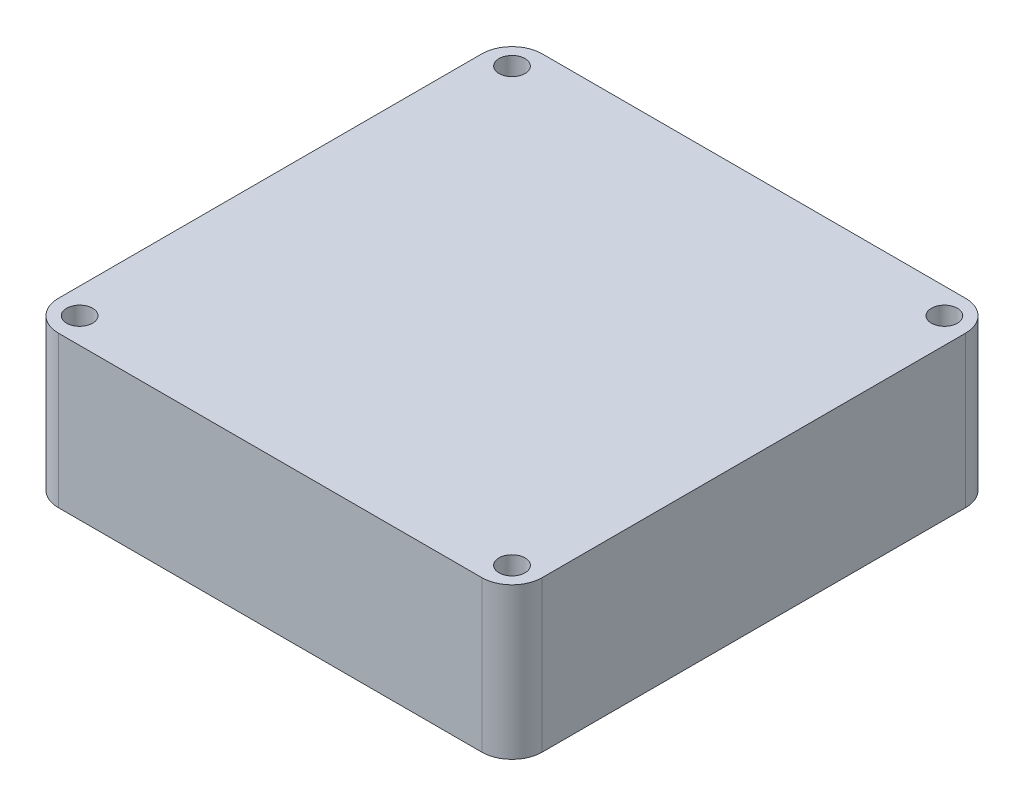
ISO-10303-21;
HEADER;
FILE_DESCRIPTION(('STEP AP214'),'2;1');
FILE_NAME('part.step','',(''),(''),'','','');
FILE_SCHEMA(('AUTOMOTIVE_DESIGN { 1 0 10303 214 1 1 1 1 }'));
ENDSEC;
DATA;
#1=APPLICATION_CONTEXT('core data for automotive mechanical design processes');
#2=APPLICATION_PROTOCOL_DEFINITION('international standard','automotive_design',2000,#1);
#3=PRODUCT_CONTEXT('',#1,'mechanical');
#4=PRODUCT('Part','Part','',(#3));
#5=PRODUCT_RELATED_PRODUCT_CATEGORY('part','',(#4));
#6=PRODUCT_DEFINITION_FORMATION('','',#4);
#7=PRODUCT_DEFINITION_CONTEXT('part definition',#1,'design');
#8=PRODUCT_DEFINITION('design','',#6,#7);
#9=PRODUCT_DEFINITION_SHAPE('','',#8);
#10=(LENGTH_UNIT() NAMED_UNIT(*) SI_UNIT(.MILLI.,.METRE.));
#11=(NAMED_UNIT(*) PLANE_ANGLE_UNIT() SI_UNIT($,.RADIAN.));
#12=(NAMED_UNIT(*) SI_UNIT($,.STERADIAN.) SOLID_ANGLE_UNIT());
#13=UNCERTAINTY_MEASURE_WITH_UNIT(LENGTH_MEASURE(1.E-05),#10,'distance_accuracy_value','');
#14=(GEOMETRIC_REPRESENTATION_CONTEXT(3) GLOBAL_UNCERTAINTY_ASSIGNED_CONTEXT((#13)) GLOBAL_UNIT_ASSIGNED_CONTEXT((#10,
#11,#12)) REPRESENTATION_CONTEXT('',''));
#15=CARTESIAN_POINT('',(0.,0.,0.));
#16=DIRECTION('',(0.,0.,1.));
#17=DIRECTION('',(1.,0.,0.));
#18=AXIS2_PLACEMENT_3D('',#15,#16,#17);
#19=CARTESIAN_POINT('',(0.,25.,0.));
#20=DIRECTION('',(0.,1.,0.));
#21=DIRECTION('',(0.,0.,1.));
#22=AXIS2_PLACEMENT_3D('',#19,#20,#21);
#23=PLANE('',#22);
#24=CARTESIAN_POINT('',(-35.7499999999999,25.,35.75));
#25=DIRECTION('',(0.,1.,0.));
#26=DIRECTION('',(0.,0.,1.));
#27=AXIS2_PLACEMENT_3D('',#24,#25,#26);
#28=CIRCLE('',#27,2.15000000000028);
#29=CARTESIAN_POINT('',(-35.7499999999999,25.,37.9000000000003));
#30=VERTEX_POINT('',#29);
#31=EDGE_CURVE('E189',#30,#30,#28,.T.);
#32=ORIENTED_EDGE('',*,*,#31,.F.);
#33=EDGE_LOOP('',(#32));
#34=FACE_BOUND('',#33,.T.);
#35=CARTESIAN_POINT('',(35.75,25.,-35.75));
#36=DIRECTION('',(0.,1.,0.));
#37=DIRECTION('',(0.,0.,1.));
#38=AXIS2_PLACEMENT_3D('',#35,#36,#37);
#39=CIRCLE('',#38,2.15);
#40=CARTESIAN_POINT('',(35.75,25.,-33.6));
#41=VERTEX_POINT('',#40);
#42=EDGE_CURVE('E179',#41,#41,#39,.T.);
#43=ORIENTED_EDGE('',*,*,#42,.F.);
#44=EDGE_LOOP('',(#43));
#45=FACE_BOUND('',#44,.T.);
#46=DIRECTION('',(-1.,0.,0.));
#47=VECTOR('',#46,1.);
#48=CARTESIAN_POINT('',(-40.,25.,-40.));
#49=LINE('',#48,#47);
#50=CARTESIAN_POINT('',(35.,25.,-40.));
#51=VERTEX_POINT('',#50);
#52=CARTESIAN_POINT('',(-35.,25.,-40.));
#53=VERTEX_POINT('',#52);
#54=EDGE_CURVE('E170',#51,#53,#49,.T.);
#55=ORIENTED_EDGE('',*,*,#54,.T.);
#56=CARTESIAN_POINT('',(-35.,25.,-35.));
#57=DIRECTION('',(0.,1.,0.));
#58=DIRECTION('',(0.,0.,1.));
#59=AXIS2_PLACEMENT_3D('',#56,#57,#58);
#60=CIRCLE('',#59,5.);
#61=CARTESIAN_POINT('',(-40.,25.,-35.));
#62=VERTEX_POINT('',#61);
#63=EDGE_CURVE('E148',#53,#62,#60,.T.);
#64=ORIENTED_EDGE('',*,*,#63,.T.);
#65=DIRECTION('',(0.,0.,1.));
#66=VECTOR('',#65,1.);
#67=CARTESIAN_POINT('',(-40.,25.,-40.));
#68=LINE('',#67,#66);
#69=CARTESIAN_POINT('',(-40.,25.,35.));
#70=VERTEX_POINT('',#69);
#71=EDGE_CURVE('E118',#62,#70,#68,.T.);
#72=ORIENTED_EDGE('',*,*,#71,.T.);
#73=CARTESIAN_POINT('',(-35.,25.,35.));
#74=DIRECTION('',(0.,1.,0.));
#75=DIRECTION('',(0.,0.,1.));
#76=AXIS2_PLACEMENT_3D('',#73,#74,#75);
#77=CIRCLE('',#76,5.);
#78=CARTESIAN_POINT('',(-35.,25.,40.));
#79=VERTEX_POINT('',#78);
#80=EDGE_CURVE('E54',#70,#79,#77,.T.);
#81=ORIENTED_EDGE('',*,*,#80,.T.);
#82=DIRECTION('',(1.,0.,0.));
#83=VECTOR('',#82,1.);
#84=CARTESIAN_POINT('',(-40.,25.,40.));
#85=LINE('',#84,#83);
#86=CARTESIAN_POINT('',(35.,25.,40.));
#87=VERTEX_POINT('',#86);
#88=EDGE_CURVE('E134',#79,#87,#85,.T.);
#89=ORIENTED_EDGE('',*,*,#88,.T.);
#90=CARTESIAN_POINT('',(35.,25.,35.));
#91=DIRECTION('',(0.,1.,0.));
#92=DIRECTION('',(0.,0.,1.));
#93=AXIS2_PLACEMENT_3D('',#90,#91,#92);
#94=CIRCLE('',#93,5.);
#95=CARTESIAN_POINT('',(40.,25.,35.));
#96=VERTEX_POINT('',#95);
#97=EDGE_CURVE('E144',#87,#96,#94,.T.);
#98=ORIENTED_EDGE('',*,*,#97,.T.);
#99=DIRECTION('',(0.,0.,-1.));
#100=VECTOR('',#99,1.);
#101=CARTESIAN_POINT('',(40.,25.,-40.));
#102=LINE('',#101,#100);
#103=CARTESIAN_POINT('',(40.,25.,-35.));
#104=VERTEX_POINT('',#103);
#105=EDGE_CURVE('E128',#96,#104,#102,.T.);
#106=ORIENTED_EDGE('',*,*,#105,.T.);
#107=CARTESIAN_POINT('',(35.,25.,-35.));
#108=DIRECTION('',(0.,1.,0.));
#109=DIRECTION('',(0.,0.,1.));
#110=AXIS2_PLACEMENT_3D('',#107,#108,#109);
#111=CIRCLE('',#110,5.);
#112=EDGE_CURVE('E146',#104,#51,#111,.T.);
#113=ORIENTED_EDGE('',*,*,#112,.T.);
#114=EDGE_LOOP('',(#55,#64,#72,#81,#89,#98,#106,#113));
#115=FACE_BOUND('',#114,.T.);
#116=CARTESIAN_POINT('',(35.7500000000001,25.,35.75));
#117=DIRECTION('',(0.,1.,0.));
#118=DIRECTION('',(0.,0.,1.));
#119=AXIS2_PLACEMENT_3D('',#116,#117,#118);
#120=CIRCLE('',#119,2.15000000000003);
#121=CARTESIAN_POINT('',(35.7500000000001,25.,37.9));
#122=VERTEX_POINT('',#121);
#123=EDGE_CURVE('E184',#122,#122,#120,.T.);
#124=ORIENTED_EDGE('',*,*,#123,.F.);
#125=EDGE_LOOP('',(#124));
#126=FACE_BOUND('',#125,.T.);
#127=CARTESIAN_POINT('',(-35.7499999999999,25.,-35.75));
#128=DIRECTION('',(0.,1.,0.));
#129=DIRECTION('',(0.,0.,1.));
#130=AXIS2_PLACEMENT_3D('',#127,#128,#129);
#131=CIRCLE('',#130,2.1500000000003);
#132=CARTESIAN_POINT('',(-35.7499999999999,25.,-33.5999999999997));
#133=VERTEX_POINT('',#132);
#134=EDGE_CURVE('E195',#133,#133,#131,.T.);
#135=ORIENTED_EDGE('',*,*,#134,.F.);
#136=EDGE_LOOP('',(#135));
#137=FACE_BOUND('',#136,.T.);
#138=ADVANCED_FACE('F34',(#34,#45,#115,#126,#137),#23,.T.);
#139=CARTESIAN_POINT('',(0.,0.,0.));
#140=DIRECTION('',(0.,1.,0.));
#141=DIRECTION('',(0.,0.,1.));
#142=AXIS2_PLACEMENT_3D('',#139,#140,#141);
#143=PLANE('',#142);
#144=DIRECTION('',(0.,0.,1.));
#145=VECTOR('',#144,1.);
#146=CARTESIAN_POINT('',(-40.,0.,-40.));
#147=LINE('',#146,#145);
#148=CARTESIAN_POINT('',(-40.,0.,-35.));
#149=VERTEX_POINT('',#148);
#150=CARTESIAN_POINT('',(-40.,0.,35.));
#151=VERTEX_POINT('',#150);
#152=EDGE_CURVE('E116',#149,#151,#147,.T.);
#153=ORIENTED_EDGE('',*,*,#152,.F.);
#154=CARTESIAN_POINT('',(-35.,0.,-35.));
#155=DIRECTION('',(0.,1.,0.));
#156=DIRECTION('',(0.,0.,1.));
#157=AXIS2_PLACEMENT_3D('',#154,#155,#156);
#158=CIRCLE('',#157,5.);
#159=CARTESIAN_POINT('',(-35.,0.,-40.));
#160=VERTEX_POINT('',#159);
#161=EDGE_CURVE('E99',#149,#160,#158,.F.);
#162=ORIENTED_EDGE('',*,*,#161,.T.);
#163=DIRECTION('',(-1.,0.,0.));
#164=VECTOR('',#163,1.);
#165=CARTESIAN_POINT('',(-40.,0.,-40.));
#166=LINE('',#165,#164);
#167=CARTESIAN_POINT('',(35.,0.,-40.));
#168=VERTEX_POINT('',#167);
#169=EDGE_CURVE('E126',#168,#160,#166,.T.);
#170=ORIENTED_EDGE('',*,*,#169,.F.);
#171=CARTESIAN_POINT('',(35.,0.,-35.));
#172=DIRECTION('',(0.,1.,0.));
#173=DIRECTION('',(0.,0.,1.));
#174=AXIS2_PLACEMENT_3D('',#171,#172,#173);
#175=CIRCLE('',#174,5.);
#176=CARTESIAN_POINT('',(40.,0.,-35.));
#177=VERTEX_POINT('',#176);
#178=EDGE_CURVE('E110',#168,#177,#175,.F.);
#179=ORIENTED_EDGE('',*,*,#178,.T.);
#180=DIRECTION('',(0.,0.,-1.));
#181=VECTOR('',#180,1.);
#182=CARTESIAN_POINT('',(40.,0.,-40.));
#183=LINE('',#182,#181);
#184=CARTESIAN_POINT('',(40.,0.,35.));
#185=VERTEX_POINT('',#184);
#186=EDGE_CURVE('E130',#185,#177,#183,.T.);
#187=ORIENTED_EDGE('',*,*,#186,.F.);
#188=CARTESIAN_POINT('',(35.,0.,35.));
#189=DIRECTION('',(0.,1.,0.));
#190=DIRECTION('',(0.,0.,1.));
#191=AXIS2_PLACEMENT_3D('',#188,#189,#190);
#192=CIRCLE('',#191,5.);
#193=CARTESIAN_POINT('',(35.,0.,40.));
#194=VERTEX_POINT('',#193);
#195=EDGE_CURVE('E137',#185,#194,#192,.F.);
#196=ORIENTED_EDGE('',*,*,#195,.T.);
#197=DIRECTION('',(1.,0.,0.));
#198=VECTOR('',#197,1.);
#199=CARTESIAN_POINT('',(-40.,0.,40.));
#200=LINE('',#199,#198);
#201=CARTESIAN_POINT('',(-35.,0.,40.));
#202=VERTEX_POINT('',#201);
#203=EDGE_CURVE('E125',#202,#194,#200,.T.);
#204=ORIENTED_EDGE('',*,*,#203,.F.);
#205=CARTESIAN_POINT('',(-35.,0.,35.));
#206=DIRECTION('',(0.,1.,0.));
#207=DIRECTION('',(0.,0.,1.));
#208=AXIS2_PLACEMENT_3D('',#205,#206,#207);
#209=CIRCLE('',#208,5.);
#210=EDGE_CURVE('E119',#202,#151,#209,.F.);
#211=ORIENTED_EDGE('',*,*,#210,.T.);
#212=EDGE_LOOP('',(#153,#162,#170,#179,#187,#196,#204,#211));
#213=FACE_BOUND('',#212,.T.);
#214=CARTESIAN_POINT('',(35.75,0.,-35.75));
#215=DIRECTION('',(0.,1.,0.));
#216=DIRECTION('',(0.,0.,1.));
#217=AXIS2_PLACEMENT_3D('',#214,#215,#216);
#218=CIRCLE('',#217,2.15);
#219=CARTESIAN_POINT('',(35.75,0.,-33.6));
#220=VERTEX_POINT('',#219);
#221=EDGE_CURVE('E175',#220,#220,#218,.T.);
#222=ORIENTED_EDGE('',*,*,#221,.T.);
#223=EDGE_LOOP('',(#222));
#224=FACE_BOUND('',#223,.T.);
#225=CARTESIAN_POINT('',(35.7500000000001,0.,35.75));
#226=DIRECTION('',(0.,1.,0.));
#227=DIRECTION('',(0.,0.,1.));
#228=AXIS2_PLACEMENT_3D('',#225,#226,#227);
#229=CIRCLE('',#228,2.15000000000003);
#230=CARTESIAN_POINT('',(35.7500000000001,0.,37.9));
#231=VERTEX_POINT('',#230);
#232=EDGE_CURVE('E186',#231,#231,#229,.T.);
#233=ORIENTED_EDGE('',*,*,#232,.T.);
#234=EDGE_LOOP('',(#233));
#235=FACE_BOUND('',#234,.T.);
#236=CARTESIAN_POINT('',(-35.7499999999999,0.,35.75));
#237=DIRECTION('',(0.,1.,0.));
#238=DIRECTION('',(0.,0.,1.));
#239=AXIS2_PLACEMENT_3D('',#236,#237,#238);
#240=CIRCLE('',#239,2.15000000000028);
#241=CARTESIAN_POINT('',(-35.7499999999999,0.,37.9000000000003));
#242=VERTEX_POINT('',#241);
#243=EDGE_CURVE('E192',#242,#242,#240,.T.);
#244=ORIENTED_EDGE('',*,*,#243,.T.);
#245=EDGE_LOOP('',(#244));
#246=FACE_BOUND('',#245,.T.);
#247=CARTESIAN_POINT('',(-35.7499999999999,0.,-35.75));
#248=DIRECTION('',(0.,1.,0.));
#249=DIRECTION('',(0.,0.,1.));
#250=AXIS2_PLACEMENT_3D('',#247,#248,#249);
#251=CIRCLE('',#250,2.1500000000003);
#252=CARTESIAN_POINT('',(-35.7499999999999,0.,-33.5999999999997));
#253=VERTEX_POINT('',#252);
#254=EDGE_CURVE('E198',#253,#253,#251,.T.);
#255=ORIENTED_EDGE('',*,*,#254,.T.);
#256=EDGE_LOOP('',(#255));
#257=FACE_BOUND('',#256,.T.);
#258=ADVANCED_FACE('F122',(#213,#224,#235,#246,#257),#143,.F.);
#259=CARTESIAN_POINT('',(40.,25.,-40.));
#260=DIRECTION('',(-1.,0.,0.));
#261=DIRECTION('',(0.,0.,1.));
#262=AXIS2_PLACEMENT_3D('',#259,#260,#261);
#263=PLANE('',#262);
#264=ORIENTED_EDGE('',*,*,#186,.T.);
#265=DIRECTION('',(0.,-1.,0.));
#266=VECTOR('',#265,1.);
#267=CARTESIAN_POINT('',(40.,25.,-35.));
#268=LINE('',#267,#266);
#269=EDGE_CURVE('E153',#177,#104,#268,.F.);
#270=ORIENTED_EDGE('',*,*,#269,.T.);
#271=ORIENTED_EDGE('',*,*,#105,.F.);
#272=DIRECTION('',(0.,-1.,0.));
#273=VECTOR('',#272,1.);
#274=CARTESIAN_POINT('',(40.,25.,35.));
#275=LINE('',#274,#273);
#276=EDGE_CURVE('E150',#96,#185,#275,.T.);
#277=ORIENTED_EDGE('',*,*,#276,.T.);
#278=EDGE_LOOP('',(#264,#270,#271,#277));
#279=FACE_BOUND('',#278,.T.);
#280=ADVANCED_FACE('F166',(#279),#263,.F.);
#281=CARTESIAN_POINT('',(-40.,25.,-40.));
#282=DIRECTION('',(0.,0.,1.));
#283=DIRECTION('',(1.,0.,0.));
#284=AXIS2_PLACEMENT_3D('',#281,#282,#283);
#285=PLANE('',#284);
#286=ORIENTED_EDGE('',*,*,#169,.T.);
#287=DIRECTION('',(0.,-1.,0.));
#288=VECTOR('',#287,1.);
#289=CARTESIAN_POINT('',(-35.,25.,-40.));
#290=LINE('',#289,#288);
#291=EDGE_CURVE('E104',#160,#53,#290,.F.);
#292=ORIENTED_EDGE('',*,*,#291,.T.);
#293=ORIENTED_EDGE('',*,*,#54,.F.);
#294=DIRECTION('',(0.,-1.,0.));
#295=VECTOR('',#294,1.);
#296=CARTESIAN_POINT('',(35.,25.,-40.));
#297=LINE('',#296,#295);
#298=EDGE_CURVE('E109',#51,#168,#297,.T.);
#299=ORIENTED_EDGE('',*,*,#298,.T.);
#300=EDGE_LOOP('',(#286,#292,#293,#299));
#301=FACE_BOUND('',#300,.T.);
#302=ADVANCED_FACE('F224',(#301),#285,.F.);
#303=CARTESIAN_POINT('',(-40.,25.,-40.));
#304=DIRECTION('',(1.,0.,0.));
#305=DIRECTION('',(0.,0.,-1.));
#306=AXIS2_PLACEMENT_3D('',#303,#304,#305);
#307=PLANE('',#306);
#308=ORIENTED_EDGE('',*,*,#71,.F.);
#309=DIRECTION('',(0.,-1.,0.));
#310=VECTOR('',#309,1.);
#311=CARTESIAN_POINT('',(-40.,25.,-35.));
#312=LINE('',#311,#310);
#313=EDGE_CURVE('E103',#62,#149,#312,.T.);
#314=ORIENTED_EDGE('',*,*,#313,.T.);
#315=ORIENTED_EDGE('',*,*,#152,.T.);
#316=DIRECTION('',(0.,-1.,0.));
#317=VECTOR('',#316,1.);
#318=CARTESIAN_POINT('',(-40.,25.,35.));
#319=LINE('',#318,#317);
#320=EDGE_CURVE('E120',#151,#70,#319,.F.);
#321=ORIENTED_EDGE('',*,*,#320,.T.);
#322=EDGE_LOOP('',(#308,#314,#315,#321));
#323=FACE_BOUND('',#322,.T.);
#324=ADVANCED_FACE('F115',(#323),#307,.F.);
#325=CARTESIAN_POINT('',(-40.,25.,40.));
#326=DIRECTION('',(0.,0.,-1.));
#327=DIRECTION('',(-1.,0.,0.));
#328=AXIS2_PLACEMENT_3D('',#325,#326,#327);
#329=PLANE('',#328);
#330=ORIENTED_EDGE('',*,*,#203,.T.);
#331=DIRECTION('',(0.,-1.,0.));
#332=VECTOR('',#331,1.);
#333=CARTESIAN_POINT('',(35.,25.,40.));
#334=LINE('',#333,#332);
#335=EDGE_CURVE('E11',#194,#87,#334,.F.);
#336=ORIENTED_EDGE('',*,*,#335,.T.);
#337=ORIENTED_EDGE('',*,*,#88,.F.);
#338=DIRECTION('',(0.,-1.,0.));
#339=VECTOR('',#338,1.);
#340=CARTESIAN_POINT('',(-35.,25.,40.));
#341=LINE('',#340,#339);
#342=EDGE_CURVE('E42',#79,#202,#341,.T.);
#343=ORIENTED_EDGE('',*,*,#342,.T.);
#344=EDGE_LOOP('',(#330,#336,#337,#343));
#345=FACE_BOUND('',#344,.T.);
#346=ADVANCED_FACE('F156',(#345),#329,.F.);
#347=CARTESIAN_POINT('',(35.75,25.,-35.75));
#348=DIRECTION('',(0.,-1.,0.));
#349=DIRECTION('',(0.,0.,-1.));
#350=AXIS2_PLACEMENT_3D('',#347,#348,#349);
#351=CYLINDRICAL_SURFACE('',#350,2.15);
#352=ORIENTED_EDGE('',*,*,#42,.T.);
#353=EDGE_LOOP('',(#352));
#354=FACE_BOUND('',#353,.T.);
#355=ORIENTED_EDGE('',*,*,#221,.F.);
#356=EDGE_LOOP('',(#355));
#357=FACE_BOUND('',#356,.T.);
#358=ADVANCED_FACE('F217',(#354,#357),#351,.F.);
#359=CARTESIAN_POINT('',(35.7500000000001,25.,35.75));
#360=DIRECTION('',(0.,-1.,0.));
#361=DIRECTION('',(0.,0.,-1.));
#362=AXIS2_PLACEMENT_3D('',#359,#360,#361);
#363=CYLINDRICAL_SURFACE('',#362,2.15000000000003);
#364=ORIENTED_EDGE('',*,*,#123,.T.);
#365=EDGE_LOOP('',(#364));
#366=FACE_BOUND('',#365,.T.);
#367=ORIENTED_EDGE('',*,*,#232,.F.);
#368=EDGE_LOOP('',(#367));
#369=FACE_BOUND('',#368,.T.);
#370=ADVANCED_FACE('F246',(#366,#369),#363,.F.);
#371=CARTESIAN_POINT('',(-35.7499999999999,25.,35.75));
#372=DIRECTION('',(0.,-1.,0.));
#373=DIRECTION('',(0.,0.,-1.));
#374=AXIS2_PLACEMENT_3D('',#371,#372,#373);
#375=CYLINDRICAL_SURFACE('',#374,2.15000000000028);
#376=ORIENTED_EDGE('',*,*,#31,.T.);
#377=EDGE_LOOP('',(#376));
#378=FACE_BOUND('',#377,.T.);
#379=ORIENTED_EDGE('',*,*,#243,.F.);
#380=EDGE_LOOP('',(#379));
#381=FACE_BOUND('',#380,.T.);
#382=ADVANCED_FACE('F249',(#378,#381),#375,.F.);
#383=CARTESIAN_POINT('',(-35.7499999999999,25.,-35.75));
#384=DIRECTION('',(0.,-1.,0.));
#385=DIRECTION('',(0.,0.,-1.));
#386=AXIS2_PLACEMENT_3D('',#383,#384,#385);
#387=CYLINDRICAL_SURFACE('',#386,2.1500000000003);
#388=ORIENTED_EDGE('',*,*,#134,.T.);
#389=EDGE_LOOP('',(#388));
#390=FACE_BOUND('',#389,.T.);
#391=ORIENTED_EDGE('',*,*,#254,.F.);
#392=EDGE_LOOP('',(#391));
#393=FACE_BOUND('',#392,.T.);
#394=ADVANCED_FACE('F204',(#390,#393),#387,.F.);
#395=CARTESIAN_POINT('',(-35.,25.,-35.));
#396=DIRECTION('',(0.,-1.,0.));
#397=DIRECTION('',(0.,0.,-1.));
#398=AXIS2_PLACEMENT_3D('',#395,#396,#397);
#399=CYLINDRICAL_SURFACE('',#398,5.);
#400=ORIENTED_EDGE('',*,*,#63,.F.);
#401=ORIENTED_EDGE('',*,*,#291,.F.);
#402=ORIENTED_EDGE('',*,*,#161,.F.);
#403=ORIENTED_EDGE('',*,*,#313,.F.);
#404=EDGE_LOOP('',(#400,#401,#402,#403));
#405=FACE_BOUND('',#404,.T.);
#406=ADVANCED_FACE('F102',(#405),#399,.T.);
#407=CARTESIAN_POINT('',(35.,25.,-35.));
#408=DIRECTION('',(0.,-1.,0.));
#409=DIRECTION('',(0.,0.,-1.));
#410=AXIS2_PLACEMENT_3D('',#407,#408,#409);
#411=CYLINDRICAL_SURFACE('',#410,5.);
#412=ORIENTED_EDGE('',*,*,#112,.F.);
#413=ORIENTED_EDGE('',*,*,#269,.F.);
#414=ORIENTED_EDGE('',*,*,#178,.F.);
#415=ORIENTED_EDGE('',*,*,#298,.F.);
#416=EDGE_LOOP('',(#412,#413,#414,#415));
#417=FACE_BOUND('',#416,.T.);
#418=ADVANCED_FACE('F232',(#417),#411,.T.);
#419=CARTESIAN_POINT('',(35.,25.,35.));
#420=DIRECTION('',(0.,-1.,0.));
#421=DIRECTION('',(0.,0.,-1.));
#422=AXIS2_PLACEMENT_3D('',#419,#420,#421);
#423=CYLINDRICAL_SURFACE('',#422,5.);
#424=ORIENTED_EDGE('',*,*,#97,.F.);
#425=ORIENTED_EDGE('',*,*,#335,.F.);
#426=ORIENTED_EDGE('',*,*,#195,.F.);
#427=ORIENTED_EDGE('',*,*,#276,.F.);
#428=EDGE_LOOP('',(#424,#425,#426,#427));
#429=FACE_BOUND('',#428,.T.);
#430=ADVANCED_FACE('F163',(#429),#423,.T.);
#431=CARTESIAN_POINT('',(-35.,25.,35.));
#432=DIRECTION('',(0.,-1.,0.));
#433=DIRECTION('',(0.,0.,-1.));
#434=AXIS2_PLACEMENT_3D('',#431,#432,#433);
#435=CYLINDRICAL_SURFACE('',#434,5.);
#436=ORIENTED_EDGE('',*,*,#80,.F.);
#437=ORIENTED_EDGE('',*,*,#320,.F.);
#438=ORIENTED_EDGE('',*,*,#210,.F.);
#439=ORIENTED_EDGE('',*,*,#342,.F.);
#440=EDGE_LOOP('',(#436,#437,#438,#439));
#441=FACE_BOUND('',#440,.T.);
#442=ADVANCED_FACE('F36',(#441),#435,.T.);
#443=CLOSED_SHELL('',(#138,#258,#280,#302,#324,#346,#358,#370,#382,#394,#406,#418,#430,#442));
#444=MANIFOLD_SOLID_BREP('B2',#443);
#445=ADVANCED_BREP_SHAPE_REPRESENTATION('',(#18,#444),#14);
#446=SHAPE_DEFINITION_REPRESENTATION(#9,#445);
ENDSEC;
END-ISO-10303-21;
